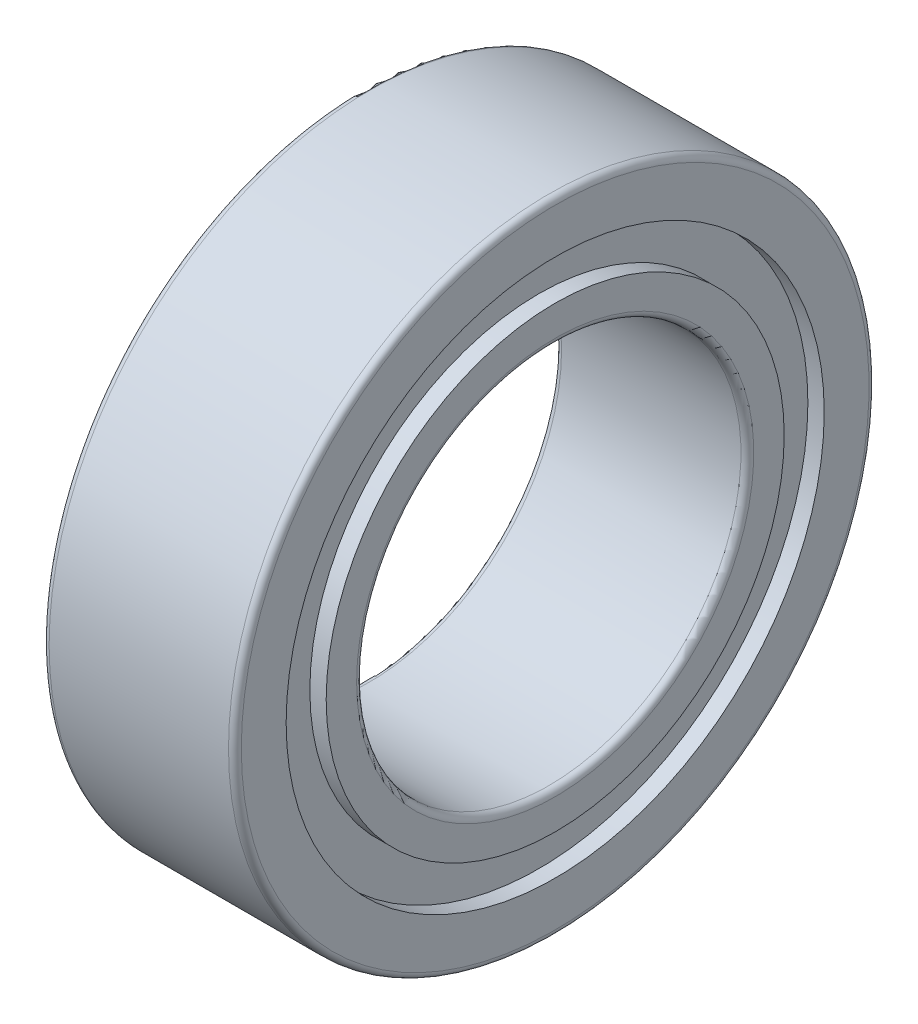
ISO-10303-21;
HEADER;
FILE_DESCRIPTION(('STEP AP214'),'2;1');
FILE_NAME('part.step','',(''),(''),'','','');
FILE_SCHEMA(('AUTOMOTIVE_DESIGN { 1 0 10303 214 1 1 1 1 }'));
ENDSEC;
DATA;
#1=APPLICATION_CONTEXT('core data for automotive mechanical design processes');
#2=APPLICATION_PROTOCOL_DEFINITION('international standard','automotive_design',2000,#1);
#3=PRODUCT_CONTEXT('',#1,'mechanical');
#4=PRODUCT('Part','Part','',(#3));
#5=PRODUCT_RELATED_PRODUCT_CATEGORY('part','',(#4));
#6=PRODUCT_DEFINITION_FORMATION('','',#4);
#7=PRODUCT_DEFINITION_CONTEXT('part definition',#1,'design');
#8=PRODUCT_DEFINITION('design','',#6,#7);
#9=PRODUCT_DEFINITION_SHAPE('','',#8);
#10=(LENGTH_UNIT() NAMED_UNIT(*) SI_UNIT(.MILLI.,.METRE.));
#11=(NAMED_UNIT(*) PLANE_ANGLE_UNIT() SI_UNIT($,.RADIAN.));
#12=(NAMED_UNIT(*) SI_UNIT($,.STERADIAN.) SOLID_ANGLE_UNIT());
#13=UNCERTAINTY_MEASURE_WITH_UNIT(LENGTH_MEASURE(1.E-05),#10,'distance_accuracy_value','');
#14=(GEOMETRIC_REPRESENTATION_CONTEXT(3) GLOBAL_UNCERTAINTY_ASSIGNED_CONTEXT((#13)) GLOBAL_UNIT_ASSIGNED_CONTEXT((#10,
#11,#12)) REPRESENTATION_CONTEXT('',''));
#15=CARTESIAN_POINT('',(0.,0.,0.));
#16=DIRECTION('',(0.,0.,1.));
#17=DIRECTION('',(1.,0.,0.));
#18=AXIS2_PLACEMENT_3D('',#15,#16,#17);
#19=CARTESIAN_POINT('',(0.,5.,0.));
#20=DIRECTION('',(1.,0.,0.));
#21=DIRECTION('',(0.,0.,-1.));
#22=AXIS2_PLACEMENT_3D('',#19,#20,#21);
#23=PLANE('',#22);
#24=CARTESIAN_POINT('',(0.,0.,0.));
#25=DIRECTION('',(1.,0.,0.));
#26=DIRECTION('',(0.,0.,-1.));
#27=AXIS2_PLACEMENT_3D('',#24,#25,#26);
#28=CIRCLE('',#27,4.9);
#29=CARTESIAN_POINT('',(0.,0.,-4.9));
#30=VERTEX_POINT('',#29);
#31=EDGE_CURVE('E51',#30,#30,#28,.F.);
#32=ORIENTED_EDGE('',*,*,#31,.T.);
#33=EDGE_LOOP('',(#32));
#34=FACE_BOUND('',#33,.T.);
#35=CARTESIAN_POINT('',(0.,0.,0.));
#36=DIRECTION('',(-1.,0.,0.));
#37=DIRECTION('',(0.,0.,1.));
#38=AXIS2_PLACEMENT_3D('',#35,#36,#37);
#39=CIRCLE('',#38,4.2);
#40=CARTESIAN_POINT('',(0.,0.,4.2));
#41=VERTEX_POINT('',#40);
#42=EDGE_CURVE('E63',#41,#41,#39,.T.);
#43=ORIENTED_EDGE('',*,*,#42,.F.);
#44=EDGE_LOOP('',(#43));
#45=FACE_BOUND('',#44,.T.);
#46=ADVANCED_FACE('F31',(#34,#45),#23,.F.);
#47=CARTESIAN_POINT('',(0.,0.,0.));
#48=DIRECTION('',(-1.,0.,0.));
#49=DIRECTION('',(0.,0.,1.));
#50=AXIS2_PLACEMENT_3D('',#47,#48,#49);
#51=CYLINDRICAL_SURFACE('',#50,4.2);
#52=CARTESIAN_POINT('',(0.255,0.,0.));
#53=DIRECTION('',(-1.,0.,0.));
#54=DIRECTION('',(0.,0.,1.));
#55=AXIS2_PLACEMENT_3D('',#52,#53,#54);
#56=CIRCLE('',#55,4.2);
#57=CARTESIAN_POINT('',(0.255,0.,4.2));
#58=VERTEX_POINT('',#57);
#59=EDGE_CURVE('E66',#58,#58,#56,.T.);
#60=ORIENTED_EDGE('',*,*,#59,.F.);
#61=EDGE_LOOP('',(#60));
#62=FACE_BOUND('',#61,.T.);
#63=ORIENTED_EDGE('',*,*,#42,.T.);
#64=EDGE_LOOP('',(#63));
#65=FACE_BOUND('',#64,.T.);
#66=ADVANCED_FACE('F119',(#62,#65),#51,.F.);
#67=CARTESIAN_POINT('',(0.255,4.2,0.));
#68=DIRECTION('',(1.,0.,0.));
#69=DIRECTION('',(0.,0.,-1.));
#70=AXIS2_PLACEMENT_3D('',#67,#68,#69);
#71=PLANE('',#70);
#72=CARTESIAN_POINT('',(0.255,0.,0.));
#73=DIRECTION('',(-1.,0.,0.));
#74=DIRECTION('',(0.,0.,1.));
#75=AXIS2_PLACEMENT_3D('',#72,#73,#74);
#76=CIRCLE('',#75,3.575);
#77=CARTESIAN_POINT('',(0.255,0.,3.575));
#78=VERTEX_POINT('',#77);
#79=EDGE_CURVE('E69',#78,#78,#76,.T.);
#80=ORIENTED_EDGE('',*,*,#79,.F.);
#81=EDGE_LOOP('',(#80));
#82=FACE_BOUND('',#81,.T.);
#83=ORIENTED_EDGE('',*,*,#59,.T.);
#84=EDGE_LOOP('',(#83));
#85=FACE_BOUND('',#84,.T.);
#86=ADVANCED_FACE('F125',(#82,#85),#71,.F.);
#87=CARTESIAN_POINT('',(0.,0.,0.));
#88=DIRECTION('',(-1.,0.,0.));
#89=DIRECTION('',(0.,0.,1.));
#90=AXIS2_PLACEMENT_3D('',#87,#88,#89);
#91=CYLINDRICAL_SURFACE('',#90,3.575);
#92=CARTESIAN_POINT('',(0.,0.,0.));
#93=DIRECTION('',(-1.,0.,0.));
#94=DIRECTION('',(0.,0.,1.));
#95=AXIS2_PLACEMENT_3D('',#92,#93,#94);
#96=CIRCLE('',#95,3.575);
#97=CARTESIAN_POINT('',(0.,0.,3.575));
#98=VERTEX_POINT('',#97);
#99=EDGE_CURVE('E72',#98,#98,#96,.T.);
#100=ORIENTED_EDGE('',*,*,#99,.F.);
#101=EDGE_LOOP('',(#100));
#102=FACE_BOUND('',#101,.T.);
#103=ORIENTED_EDGE('',*,*,#79,.T.);
#104=EDGE_LOOP('',(#103));
#105=FACE_BOUND('',#104,.T.);
#106=ADVANCED_FACE('F178',(#102,#105),#91,.T.);
#107=CARTESIAN_POINT('',(0.,3.575,0.));
#108=DIRECTION('',(1.,0.,0.));
#109=DIRECTION('',(0.,0.,-1.));
#110=AXIS2_PLACEMENT_3D('',#107,#108,#109);
#111=PLANE('',#110);
#112=CARTESIAN_POINT('',(0.,0.,0.));
#113=DIRECTION('',(1.,0.,0.));
#114=DIRECTION('',(0.,0.,-1.));
#115=AXIS2_PLACEMENT_3D('',#112,#113,#114);
#116=CIRCLE('',#115,3.1);
#117=CARTESIAN_POINT('',(0.,0.,-3.1));
#118=VERTEX_POINT('',#117);
#119=EDGE_CURVE('E10',#118,#118,#116,.T.);
#120=ORIENTED_EDGE('',*,*,#119,.T.);
#121=EDGE_LOOP('',(#120));
#122=FACE_BOUND('',#121,.T.);
#123=ORIENTED_EDGE('',*,*,#99,.T.);
#124=EDGE_LOOP('',(#123));
#125=FACE_BOUND('',#124,.T.);
#126=ADVANCED_FACE('F116',(#122,#125),#111,.F.);
#127=CARTESIAN_POINT('',(0.,0.,0.));
#128=DIRECTION('',(-1.,0.,0.));
#129=DIRECTION('',(0.,0.,1.));
#130=AXIS2_PLACEMENT_3D('',#127,#128,#129);
#131=CYLINDRICAL_SURFACE('',#130,3.);
#132=CARTESIAN_POINT('',(2.9,0.,0.));
#133=DIRECTION('',(-1.,0.,0.));
#134=DIRECTION('',(0.,0.,1.));
#135=AXIS2_PLACEMENT_3D('',#132,#133,#134);
#136=CIRCLE('',#135,3.);
#137=CARTESIAN_POINT('',(2.9,0.,3.));
#138=VERTEX_POINT('',#137);
#139=EDGE_CURVE('E38',#138,#138,#136,.F.);
#140=ORIENTED_EDGE('',*,*,#139,.T.);
#141=EDGE_LOOP('',(#140));
#142=FACE_BOUND('',#141,.T.);
#143=CARTESIAN_POINT('',(0.0999999999999999,0.,0.));
#144=DIRECTION('',(1.,0.,0.));
#145=DIRECTION('',(0.,0.,-1.));
#146=AXIS2_PLACEMENT_3D('',#143,#144,#145);
#147=CIRCLE('',#146,3.);
#148=CARTESIAN_POINT('',(0.0999999999999999,0.,-3.));
#149=VERTEX_POINT('',#148);
#150=EDGE_CURVE('E42',#149,#149,#147,.F.);
#151=ORIENTED_EDGE('',*,*,#150,.T.);
#152=EDGE_LOOP('',(#151));
#153=FACE_BOUND('',#152,.T.);
#154=ADVANCED_FACE('F110',(#142,#153),#131,.F.);
#155=CARTESIAN_POINT('',(3.,3.575,0.));
#156=DIRECTION('',(-1.,0.,0.));
#157=DIRECTION('',(0.,0.,1.));
#158=AXIS2_PLACEMENT_3D('',#155,#156,#157);
#159=PLANE('',#158);
#160=CARTESIAN_POINT('',(3.,0.,0.));
#161=DIRECTION('',(-1.,0.,0.));
#162=DIRECTION('',(0.,0.,1.));
#163=AXIS2_PLACEMENT_3D('',#160,#161,#162);
#164=CIRCLE('',#163,3.1);
#165=CARTESIAN_POINT('',(3.,0.,3.1));
#166=VERTEX_POINT('',#165);
#167=EDGE_CURVE('E46',#166,#166,#164,.T.);
#168=ORIENTED_EDGE('',*,*,#167,.T.);
#169=EDGE_LOOP('',(#168));
#170=FACE_BOUND('',#169,.T.);
#171=CARTESIAN_POINT('',(3.,0.,0.));
#172=DIRECTION('',(-1.,0.,0.));
#173=DIRECTION('',(0.,0.,1.));
#174=AXIS2_PLACEMENT_3D('',#171,#172,#173);
#175=CIRCLE('',#174,3.575);
#176=CARTESIAN_POINT('',(3.,0.,3.575));
#177=VERTEX_POINT('',#176);
#178=EDGE_CURVE('E75',#177,#177,#175,.T.);
#179=ORIENTED_EDGE('',*,*,#178,.F.);
#180=EDGE_LOOP('',(#179));
#181=FACE_BOUND('',#180,.T.);
#182=ADVANCED_FACE('F105',(#170,#181),#159,.F.);
#183=CARTESIAN_POINT('',(0.,0.,0.));
#184=DIRECTION('',(-1.,0.,0.));
#185=DIRECTION('',(0.,0.,1.));
#186=AXIS2_PLACEMENT_3D('',#183,#184,#185);
#187=CYLINDRICAL_SURFACE('',#186,3.575);
#188=CARTESIAN_POINT('',(2.745,0.,0.));
#189=DIRECTION('',(-1.,0.,0.));
#190=DIRECTION('',(0.,0.,1.));
#191=AXIS2_PLACEMENT_3D('',#188,#189,#190);
#192=CIRCLE('',#191,3.575);
#193=CARTESIAN_POINT('',(2.745,0.,3.575));
#194=VERTEX_POINT('',#193);
#195=EDGE_CURVE('E78',#194,#194,#192,.T.);
#196=ORIENTED_EDGE('',*,*,#195,.F.);
#197=EDGE_LOOP('',(#196));
#198=FACE_BOUND('',#197,.T.);
#199=ORIENTED_EDGE('',*,*,#178,.T.);
#200=EDGE_LOOP('',(#199));
#201=FACE_BOUND('',#200,.T.);
#202=ADVANCED_FACE('F99',(#198,#201),#187,.T.);
#203=CARTESIAN_POINT('',(2.745,4.2,0.));
#204=DIRECTION('',(-1.,0.,0.));
#205=DIRECTION('',(0.,0.,1.));
#206=AXIS2_PLACEMENT_3D('',#203,#204,#205);
#207=PLANE('',#206);
#208=CARTESIAN_POINT('',(2.745,0.,0.));
#209=DIRECTION('',(-1.,0.,0.));
#210=DIRECTION('',(0.,0.,1.));
#211=AXIS2_PLACEMENT_3D('',#208,#209,#210);
#212=CIRCLE('',#211,4.2);
#213=CARTESIAN_POINT('',(2.745,0.,4.2));
#214=VERTEX_POINT('',#213);
#215=EDGE_CURVE('E81',#214,#214,#212,.T.);
#216=ORIENTED_EDGE('',*,*,#215,.F.);
#217=EDGE_LOOP('',(#216));
#218=FACE_BOUND('',#217,.T.);
#219=ORIENTED_EDGE('',*,*,#195,.T.);
#220=EDGE_LOOP('',(#219));
#221=FACE_BOUND('',#220,.T.);
#222=ADVANCED_FACE('F93',(#218,#221),#207,.F.);
#223=CARTESIAN_POINT('',(0.,0.,0.));
#224=DIRECTION('',(-1.,0.,0.));
#225=DIRECTION('',(0.,0.,1.));
#226=AXIS2_PLACEMENT_3D('',#223,#224,#225);
#227=CYLINDRICAL_SURFACE('',#226,4.2);
#228=CARTESIAN_POINT('',(3.,0.,0.));
#229=DIRECTION('',(-1.,0.,0.));
#230=DIRECTION('',(0.,0.,1.));
#231=AXIS2_PLACEMENT_3D('',#228,#229,#230);
#232=CIRCLE('',#231,4.2);
#233=CARTESIAN_POINT('',(3.,0.,4.2));
#234=VERTEX_POINT('',#233);
#235=EDGE_CURVE('E84',#234,#234,#232,.T.);
#236=ORIENTED_EDGE('',*,*,#235,.F.);
#237=EDGE_LOOP('',(#236));
#238=FACE_BOUND('',#237,.T.);
#239=ORIENTED_EDGE('',*,*,#215,.T.);
#240=EDGE_LOOP('',(#239));
#241=FACE_BOUND('',#240,.T.);
#242=ADVANCED_FACE('F90',(#238,#241),#227,.F.);
#243=CARTESIAN_POINT('',(3.,5.,0.));
#244=DIRECTION('',(-1.,0.,0.));
#245=DIRECTION('',(0.,0.,1.));
#246=AXIS2_PLACEMENT_3D('',#243,#244,#245);
#247=PLANE('',#246);
#248=CARTESIAN_POINT('',(3.,0.,0.));
#249=DIRECTION('',(-1.,0.,0.));
#250=DIRECTION('',(0.,0.,1.));
#251=AXIS2_PLACEMENT_3D('',#248,#249,#250);
#252=CIRCLE('',#251,4.9);
#253=CARTESIAN_POINT('',(3.,0.,4.9));
#254=VERTEX_POINT('',#253);
#255=EDGE_CURVE('E54',#254,#254,#252,.F.);
#256=ORIENTED_EDGE('',*,*,#255,.T.);
#257=EDGE_LOOP('',(#256));
#258=FACE_BOUND('',#257,.T.);
#259=ORIENTED_EDGE('',*,*,#235,.T.);
#260=EDGE_LOOP('',(#259));
#261=FACE_BOUND('',#260,.T.);
#262=ADVANCED_FACE('F88',(#258,#261),#247,.F.);
#263=CARTESIAN_POINT('',(0.,0.,0.));
#264=DIRECTION('',(-1.,0.,0.));
#265=DIRECTION('',(0.,0.,1.));
#266=AXIS2_PLACEMENT_3D('',#263,#264,#265);
#267=CYLINDRICAL_SURFACE('',#266,5.);
#268=CARTESIAN_POINT('',(2.9,0.,0.));
#269=DIRECTION('',(-1.,0.,0.));
#270=DIRECTION('',(0.,0.,1.));
#271=AXIS2_PLACEMENT_3D('',#268,#269,#270);
#272=CIRCLE('',#271,5.);
#273=CARTESIAN_POINT('',(2.9,0.,5.));
#274=VERTEX_POINT('',#273);
#275=EDGE_CURVE('E57',#274,#274,#272,.T.);
#276=ORIENTED_EDGE('',*,*,#275,.T.);
#277=EDGE_LOOP('',(#276));
#278=FACE_BOUND('',#277,.T.);
#279=CARTESIAN_POINT('',(0.0999999999999997,0.,0.));
#280=DIRECTION('',(1.,0.,0.));
#281=DIRECTION('',(0.,0.,-1.));
#282=AXIS2_PLACEMENT_3D('',#279,#280,#281);
#283=CIRCLE('',#282,5.);
#284=CARTESIAN_POINT('',(0.0999999999999997,0.,-5.));
#285=VERTEX_POINT('',#284);
#286=EDGE_CURVE('E60',#285,#285,#283,.T.);
#287=ORIENTED_EDGE('',*,*,#286,.T.);
#288=EDGE_LOOP('',(#287));
#289=FACE_BOUND('',#288,.T.);
#290=ADVANCED_FACE('F135',(#278,#289),#267,.T.);
#291=CARTESIAN_POINT('',(2.9,0.,0.));
#292=DIRECTION('',(-1.,0.,0.));
#293=DIRECTION('',(0.,0.,1.));
#294=AXIS2_PLACEMENT_3D('',#291,#292,#293);
#295=TOROIDAL_SURFACE('',#294,4.9,0.1);
#296=ORIENTED_EDGE('',*,*,#255,.F.);
#297=EDGE_LOOP('',(#296));
#298=FACE_BOUND('',#297,.T.);
#299=ORIENTED_EDGE('',*,*,#275,.F.);
#300=EDGE_LOOP('',(#299));
#301=FACE_BOUND('',#300,.T.);
#302=ADVANCED_FACE('F131',(#298,#301),#295,.T.);
#303=CARTESIAN_POINT('',(0.0999999999999997,0.,0.));
#304=DIRECTION('',(1.,0.,0.));
#305=DIRECTION('',(0.,0.,-1.));
#306=AXIS2_PLACEMENT_3D('',#303,#304,#305);
#307=TOROIDAL_SURFACE('',#306,4.9,0.1);
#308=ORIENTED_EDGE('',*,*,#286,.F.);
#309=EDGE_LOOP('',(#308));
#310=FACE_BOUND('',#309,.T.);
#311=ORIENTED_EDGE('',*,*,#31,.F.);
#312=EDGE_LOOP('',(#311));
#313=FACE_BOUND('',#312,.T.);
#314=ADVANCED_FACE('F134',(#310,#313),#307,.T.);
#315=CARTESIAN_POINT('',(2.9,0.,0.));
#316=DIRECTION('',(-1.,0.,0.));
#317=DIRECTION('',(0.,0.,1.));
#318=AXIS2_PLACEMENT_3D('',#315,#316,#317);
#319=TOROIDAL_SURFACE('',#318,3.1,0.1);
#320=ORIENTED_EDGE('',*,*,#139,.F.);
#321=EDGE_LOOP('',(#320));
#322=FACE_BOUND('',#321,.T.);
#323=ORIENTED_EDGE('',*,*,#167,.F.);
#324=EDGE_LOOP('',(#323));
#325=FACE_BOUND('',#324,.T.);
#326=ADVANCED_FACE('F138',(#322,#325),#319,.T.);
#327=CARTESIAN_POINT('',(0.0999999999999999,0.,0.));
#328=DIRECTION('',(1.,0.,0.));
#329=DIRECTION('',(0.,0.,-1.));
#330=AXIS2_PLACEMENT_3D('',#327,#328,#329);
#331=TOROIDAL_SURFACE('',#330,3.1,0.1);
#332=ORIENTED_EDGE('',*,*,#119,.F.);
#333=EDGE_LOOP('',(#332));
#334=FACE_BOUND('',#333,.T.);
#335=ORIENTED_EDGE('',*,*,#150,.F.);
#336=EDGE_LOOP('',(#335));
#337=FACE_BOUND('',#336,.T.);
#338=ADVANCED_FACE('F33',(#334,#337),#331,.T.);
#339=CLOSED_SHELL('',(#46,#66,#86,#106,#126,#154,#182,#202,#222,#242,#262,#290,#302,#314,#326,#338));
#340=MANIFOLD_SOLID_BREP('B2',#339);
#341=ADVANCED_BREP_SHAPE_REPRESENTATION('',(#18,#340),#14);
#342=SHAPE_DEFINITION_REPRESENTATION(#9,#341);
ENDSEC;
END-ISO-10303-21;
